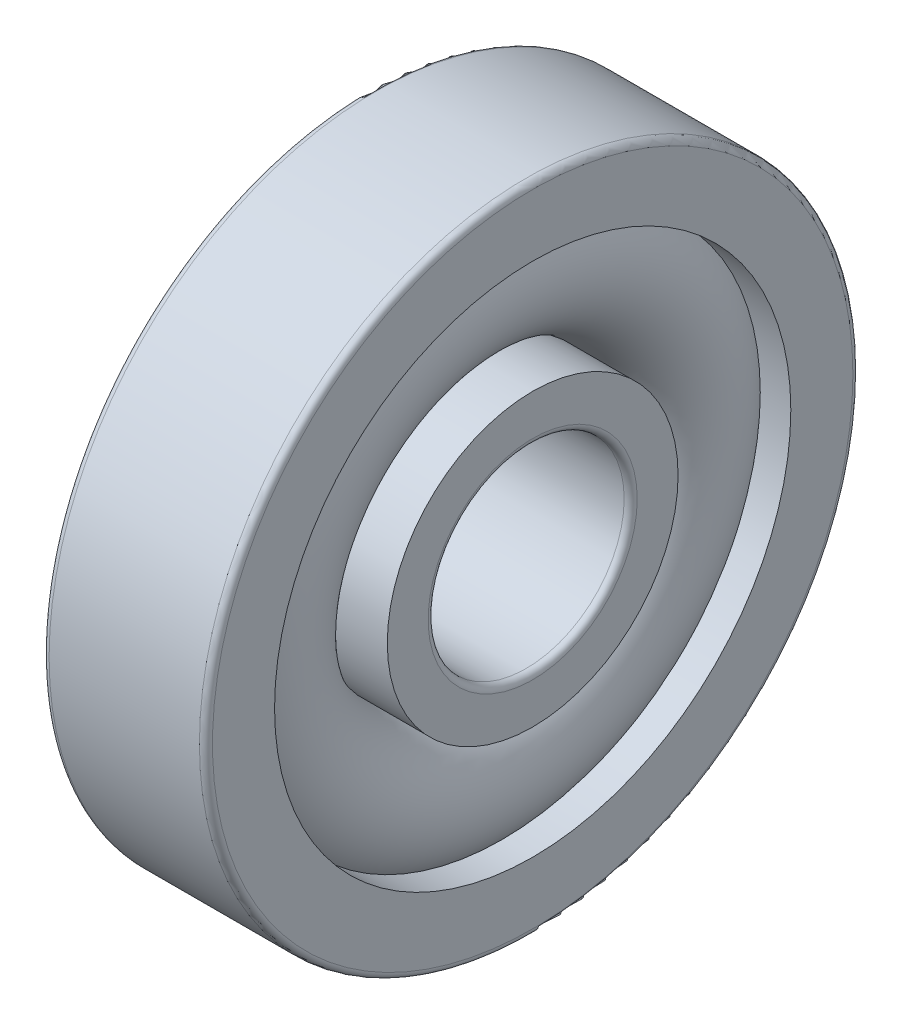
ISO-10303-21;
HEADER;
FILE_DESCRIPTION(('STEP AP214'),'2;1');
FILE_NAME('part.step','',(''),(''),'','','');
FILE_SCHEMA(('AUTOMOTIVE_DESIGN { 1 0 10303 214 1 1 1 1 }'));
ENDSEC;
DATA;
#1=APPLICATION_CONTEXT('core data for automotive mechanical design processes');
#2=APPLICATION_PROTOCOL_DEFINITION('international standard','automotive_design',2000,#1);
#3=PRODUCT_CONTEXT('',#1,'mechanical');
#4=PRODUCT('Part','Part','',(#3));
#5=PRODUCT_RELATED_PRODUCT_CATEGORY('part','',(#4));
#6=PRODUCT_DEFINITION_FORMATION('','',#4);
#7=PRODUCT_DEFINITION_CONTEXT('part definition',#1,'design');
#8=PRODUCT_DEFINITION('design','',#6,#7);
#9=PRODUCT_DEFINITION_SHAPE('','',#8);
#10=(LENGTH_UNIT() NAMED_UNIT(*) SI_UNIT(.MILLI.,.METRE.));
#11=(NAMED_UNIT(*) PLANE_ANGLE_UNIT() SI_UNIT($,.RADIAN.));
#12=(NAMED_UNIT(*) SI_UNIT($,.STERADIAN.) SOLID_ANGLE_UNIT());
#13=UNCERTAINTY_MEASURE_WITH_UNIT(LENGTH_MEASURE(1.E-05),#10,'distance_accuracy_value','');
#14=(GEOMETRIC_REPRESENTATION_CONTEXT(3) GLOBAL_UNCERTAINTY_ASSIGNED_CONTEXT((#13)) GLOBAL_UNIT_ASSIGNED_CONTEXT((#10,
#11,#12)) REPRESENTATION_CONTEXT('',''));
#15=CARTESIAN_POINT('',(0.,0.,0.));
#16=DIRECTION('',(0.,0.,1.));
#17=DIRECTION('',(1.,0.,0.));
#18=AXIS2_PLACEMENT_3D('',#15,#16,#17);
#19=CARTESIAN_POINT('',(0.,0.,0.));
#20=DIRECTION('',(-1.,0.,0.));
#21=DIRECTION('',(0.,0.,1.));
#22=AXIS2_PLACEMENT_3D('',#19,#20,#21);
#23=TOROIDAL_SURFACE('',#22,3.25,1.05);
#24=CARTESIAN_POINT('',(0.782623792124926,0.,0.));
#25=DIRECTION('',(-1.,0.,0.));
#26=DIRECTION('',(0.,0.,1.));
#27=AXIS2_PLACEMENT_3D('',#24,#25,#26);
#28=CIRCLE('',#27,3.95);
#29=CARTESIAN_POINT('',(0.782623792124926,0.,3.95));
#30=VERTEX_POINT('',#29);
#31=EDGE_CURVE('E39',#30,#30,#28,.F.);
#32=ORIENTED_EDGE('',*,*,#31,.T.);
#33=EDGE_LOOP('',(#32));
#34=FACE_BOUND('',#33,.T.);
#35=CARTESIAN_POINT('',(0.227760839478607,0.,0.));
#36=DIRECTION('',(-1.,0.,0.));
#37=DIRECTION('',(0.,0.,1.));
#38=AXIS2_PLACEMENT_3D('',#35,#36,#37);
#39=CIRCLE('',#38,2.225);
#40=CARTESIAN_POINT('',(0.227760839478607,0.,2.225));
#41=VERTEX_POINT('',#40);
#42=EDGE_CURVE('E10',#41,#41,#39,.T.);
#43=ORIENTED_EDGE('',*,*,#42,.T.);
#44=EDGE_LOOP('',(#43));
#45=FACE_BOUND('',#44,.T.);
#46=ADVANCED_FACE('F35',(#34,#45),#23,.T.);
#47=CARTESIAN_POINT('',(-20.6375,0.,0.));
#48=DIRECTION('',(1.,0.,0.));
#49=DIRECTION('',(0.,0.,-1.));
#50=AXIS2_PLACEMENT_3D('',#47,#48,#49);
#51=CYLINDRICAL_SURFACE('',#50,2.225);
#52=CARTESIAN_POINT('',(1.25,0.,0.));
#53=DIRECTION('',(1.,0.,0.));
#54=DIRECTION('',(0.,0.,-1.));
#55=AXIS2_PLACEMENT_3D('',#52,#53,#54);
#56=CIRCLE('',#55,2.225);
#57=CARTESIAN_POINT('',(1.25,0.,-2.225));
#58=VERTEX_POINT('',#57);
#59=EDGE_CURVE('E48',#58,#58,#56,.T.);
#60=ORIENTED_EDGE('',*,*,#59,.F.);
#61=EDGE_LOOP('',(#60));
#62=FACE_BOUND('',#61,.T.);
#63=ORIENTED_EDGE('',*,*,#42,.F.);
#64=EDGE_LOOP('',(#63));
#65=FACE_BOUND('',#64,.T.);
#66=ADVANCED_FACE('F87',(#62,#65),#51,.T.);
#67=CARTESIAN_POINT('',(-20.6375,0.,0.));
#68=DIRECTION('',(1.,0.,0.));
#69=DIRECTION('',(0.,0.,-1.));
#70=AXIS2_PLACEMENT_3D('',#67,#68,#69);
#71=CYLINDRICAL_SURFACE('',#70,2.55);
#72=CARTESIAN_POINT('',(-1.25,0.,0.));
#73=DIRECTION('',(1.,0.,0.));
#74=DIRECTION('',(0.,0.,-1.));
#75=AXIS2_PLACEMENT_3D('',#72,#73,#74);
#76=CIRCLE('',#75,2.55);
#77=CARTESIAN_POINT('',(-1.25,0.,-2.55));
#78=VERTEX_POINT('',#77);
#79=EDGE_CURVE('E57',#78,#78,#76,.T.);
#80=ORIENTED_EDGE('',*,*,#79,.T.);
#81=EDGE_LOOP('',(#80));
#82=FACE_BOUND('',#81,.T.);
#83=CARTESIAN_POINT('',(-0.782623792124926,0.,0.));
#84=DIRECTION('',(1.,0.,0.));
#85=DIRECTION('',(0.,0.,-1.));
#86=AXIS2_PLACEMENT_3D('',#83,#84,#85);
#87=CIRCLE('',#86,2.55);
#88=CARTESIAN_POINT('',(-0.782623792124926,0.,-2.55));
#89=VERTEX_POINT('',#88);
#90=EDGE_CURVE('E43',#89,#89,#87,.T.);
#91=ORIENTED_EDGE('',*,*,#90,.F.);
#92=EDGE_LOOP('',(#91));
#93=FACE_BOUND('',#92,.T.);
#94=ADVANCED_FACE('F90',(#82,#93),#71,.T.);
#95=CARTESIAN_POINT('',(1.25,1.6,0.));
#96=DIRECTION('',(1.,0.,0.));
#97=DIRECTION('',(0.,0.,-1.));
#98=AXIS2_PLACEMENT_3D('',#95,#96,#97);
#99=PLANE('',#98);
#100=ORIENTED_EDGE('',*,*,#59,.T.);
#101=EDGE_LOOP('',(#100));
#102=FACE_BOUND('',#101,.T.);
#103=CARTESIAN_POINT('',(1.25,0.,0.));
#104=DIRECTION('',(1.,0.,0.));
#105=DIRECTION('',(0.,0.,-1.));
#106=AXIS2_PLACEMENT_3D('',#103,#104,#105);
#107=CIRCLE('',#106,1.6);
#108=CARTESIAN_POINT('',(1.25,0.,-1.6));
#109=VERTEX_POINT('',#108);
#110=EDGE_CURVE('E79',#109,#109,#107,.T.);
#111=ORIENTED_EDGE('',*,*,#110,.F.);
#112=EDGE_LOOP('',(#111));
#113=FACE_BOUND('',#112,.T.);
#114=ADVANCED_FACE('F84',(#102,#113),#99,.T.);
#115=CARTESIAN_POINT('',(1.15,0.,0.));
#116=DIRECTION('',(1.,0.,0.));
#117=DIRECTION('',(0.,0.,-1.));
#118=AXIS2_PLACEMENT_3D('',#115,#116,#117);
#119=TOROIDAL_SURFACE('',#118,1.6,0.1);
#120=ORIENTED_EDGE('',*,*,#110,.T.);
#121=EDGE_LOOP('',(#120));
#122=FACE_BOUND('',#121,.T.);
#123=CARTESIAN_POINT('',(1.15,0.,0.));
#124=DIRECTION('',(1.,0.,0.));
#125=DIRECTION('',(0.,0.,-1.));
#126=AXIS2_PLACEMENT_3D('',#123,#124,#125);
#127=CIRCLE('',#126,1.5);
#128=CARTESIAN_POINT('',(1.15,0.,-1.5));
#129=VERTEX_POINT('',#128);
#130=EDGE_CURVE('E76',#129,#129,#127,.T.);
#131=ORIENTED_EDGE('',*,*,#130,.F.);
#132=EDGE_LOOP('',(#131));
#133=FACE_BOUND('',#132,.T.);
#134=ADVANCED_FACE('F101',(#122,#133),#119,.T.);
#135=CARTESIAN_POINT('',(-20.6375,0.,0.));
#136=DIRECTION('',(1.,0.,0.));
#137=DIRECTION('',(0.,0.,-1.));
#138=AXIS2_PLACEMENT_3D('',#135,#136,#137);
#139=CYLINDRICAL_SURFACE('',#138,1.5);
#140=ORIENTED_EDGE('',*,*,#130,.T.);
#141=EDGE_LOOP('',(#140));
#142=FACE_BOUND('',#141,.T.);
#143=CARTESIAN_POINT('',(-1.15,0.,0.));
#144=DIRECTION('',(1.,0.,0.));
#145=DIRECTION('',(0.,0.,-1.));
#146=AXIS2_PLACEMENT_3D('',#143,#144,#145);
#147=CIRCLE('',#146,1.5);
#148=CARTESIAN_POINT('',(-1.15,0.,-1.5));
#149=VERTEX_POINT('',#148);
#150=EDGE_CURVE('E73',#149,#149,#147,.T.);
#151=ORIENTED_EDGE('',*,*,#150,.F.);
#152=EDGE_LOOP('',(#151));
#153=FACE_BOUND('',#152,.T.);
#154=ADVANCED_FACE('F104',(#142,#153),#139,.F.);
#155=CARTESIAN_POINT('',(-1.15,0.,0.));
#156=DIRECTION('',(1.,0.,0.));
#157=DIRECTION('',(0.,0.,-1.));
#158=AXIS2_PLACEMENT_3D('',#155,#156,#157);
#159=TOROIDAL_SURFACE('',#158,1.6,0.1);
#160=ORIENTED_EDGE('',*,*,#150,.T.);
#161=EDGE_LOOP('',(#160));
#162=FACE_BOUND('',#161,.T.);
#163=CARTESIAN_POINT('',(-1.25,0.,0.));
#164=DIRECTION('',(1.,0.,0.));
#165=DIRECTION('',(0.,0.,-1.));
#166=AXIS2_PLACEMENT_3D('',#163,#164,#165);
#167=CIRCLE('',#166,1.6);
#168=CARTESIAN_POINT('',(-1.25,0.,-1.6));
#169=VERTEX_POINT('',#168);
#170=EDGE_CURVE('E70',#169,#169,#167,.T.);
#171=ORIENTED_EDGE('',*,*,#170,.F.);
#172=EDGE_LOOP('',(#171));
#173=FACE_BOUND('',#172,.T.);
#174=ADVANCED_FACE('F108',(#162,#173),#159,.T.);
#175=CARTESIAN_POINT('',(-1.25,2.55,0.));
#176=DIRECTION('',(-1.,0.,0.));
#177=DIRECTION('',(0.,0.,1.));
#178=AXIS2_PLACEMENT_3D('',#175,#176,#177);
#179=PLANE('',#178);
#180=ORIENTED_EDGE('',*,*,#170,.T.);
#181=EDGE_LOOP('',(#180));
#182=FACE_BOUND('',#181,.T.);
#183=ORIENTED_EDGE('',*,*,#79,.F.);
#184=EDGE_LOOP('',(#183));
#185=FACE_BOUND('',#184,.T.);
#186=ADVANCED_FACE('F112',(#182,#185),#179,.T.);
#187=CARTESIAN_POINT('',(-0.227760839478607,0.,0.));
#188=DIRECTION('',(1.,0.,0.));
#189=DIRECTION('',(0.,0.,-1.));
#190=AXIS2_PLACEMENT_3D('',#187,#188,#189);
#191=CIRCLE('',#190,4.275);
#192=CARTESIAN_POINT('',(-0.227760839478607,0.,-4.275));
#193=VERTEX_POINT('',#192);
#194=EDGE_CURVE('E51',#193,#193,#191,.F.);
#195=ORIENTED_EDGE('',*,*,#194,.T.);
#196=EDGE_LOOP('',(#195));
#197=FACE_BOUND('',#196,.T.);
#198=ORIENTED_EDGE('',*,*,#90,.T.);
#199=EDGE_LOOP('',(#198));
#200=FACE_BOUND('',#199,.T.);
#201=ADVANCED_FACE('F37',(#197,#200),#23,.T.);
#202=CARTESIAN_POINT('',(-20.6375,0.,0.));
#203=DIRECTION('',(1.,0.,0.));
#204=DIRECTION('',(0.,0.,-1.));
#205=AXIS2_PLACEMENT_3D('',#202,#203,#204);
#206=CYLINDRICAL_SURFACE('',#205,3.95);
#207=CARTESIAN_POINT('',(1.25,0.,0.));
#208=DIRECTION('',(1.,0.,0.));
#209=DIRECTION('',(0.,0.,-1.));
#210=AXIS2_PLACEMENT_3D('',#207,#208,#209);
#211=CIRCLE('',#210,3.95);
#212=CARTESIAN_POINT('',(1.25,0.,-3.95));
#213=VERTEX_POINT('',#212);
#214=EDGE_CURVE('E153',#213,#213,#211,.T.);
#215=ORIENTED_EDGE('',*,*,#214,.T.);
#216=EDGE_LOOP('',(#215));
#217=FACE_BOUND('',#216,.T.);
#218=ORIENTED_EDGE('',*,*,#31,.F.);
#219=EDGE_LOOP('',(#218));
#220=FACE_BOUND('',#219,.T.);
#221=ADVANCED_FACE('F134',(#217,#220),#206,.F.);
#222=CARTESIAN_POINT('',(-20.6375,0.,0.));
#223=DIRECTION('',(1.,0.,0.));
#224=DIRECTION('',(0.,0.,-1.));
#225=AXIS2_PLACEMENT_3D('',#222,#223,#224);
#226=CYLINDRICAL_SURFACE('',#225,4.275);
#227=CARTESIAN_POINT('',(-1.25,0.,0.));
#228=DIRECTION('',(1.,0.,0.));
#229=DIRECTION('',(0.,0.,-1.));
#230=AXIS2_PLACEMENT_3D('',#227,#228,#229);
#231=CIRCLE('',#230,4.275);
#232=CARTESIAN_POINT('',(-1.25,0.,-4.275));
#233=VERTEX_POINT('',#232);
#234=EDGE_CURVE('E148',#233,#233,#231,.T.);
#235=ORIENTED_EDGE('',*,*,#234,.F.);
#236=EDGE_LOOP('',(#235));
#237=FACE_BOUND('',#236,.T.);
#238=ORIENTED_EDGE('',*,*,#194,.F.);
#239=EDGE_LOOP('',(#238));
#240=FACE_BOUND('',#239,.T.);
#241=ADVANCED_FACE('F121',(#237,#240),#226,.F.);
#242=CARTESIAN_POINT('',(-1.15,0.,0.));
#243=DIRECTION('',(1.,0.,0.));
#244=DIRECTION('',(0.,0.,-1.));
#245=AXIS2_PLACEMENT_3D('',#242,#243,#244);
#246=TOROIDAL_SURFACE('',#245,4.9,0.0999999999999986);
#247=CARTESIAN_POINT('',(-1.25,0.,0.));
#248=DIRECTION('',(1.,0.,0.));
#249=DIRECTION('',(0.,0.,-1.));
#250=AXIS2_PLACEMENT_3D('',#247,#248,#249);
#251=CIRCLE('',#250,4.9);
#252=CARTESIAN_POINT('',(-1.25,0.,-4.9));
#253=VERTEX_POINT('',#252);
#254=EDGE_CURVE('E151',#253,#253,#251,.T.);
#255=ORIENTED_EDGE('',*,*,#254,.T.);
#256=EDGE_LOOP('',(#255));
#257=FACE_BOUND('',#256,.T.);
#258=CARTESIAN_POINT('',(-1.15,0.,0.));
#259=DIRECTION('',(1.,0.,0.));
#260=DIRECTION('',(0.,0.,-1.));
#261=AXIS2_PLACEMENT_3D('',#258,#259,#260);
#262=CIRCLE('',#261,5.);
#263=CARTESIAN_POINT('',(-1.15,0.,-5.));
#264=VERTEX_POINT('',#263);
#265=EDGE_CURVE('E53',#264,#264,#262,.T.);
#266=ORIENTED_EDGE('',*,*,#265,.F.);
#267=EDGE_LOOP('',(#266));
#268=FACE_BOUND('',#267,.T.);
#269=ADVANCED_FACE('F117',(#257,#268),#246,.T.);
#270=CARTESIAN_POINT('',(-20.6375,0.,0.));
#271=DIRECTION('',(1.,0.,0.));
#272=DIRECTION('',(0.,0.,-1.));
#273=AXIS2_PLACEMENT_3D('',#270,#271,#272);
#274=CYLINDRICAL_SURFACE('',#273,5.);
#275=ORIENTED_EDGE('',*,*,#265,.T.);
#276=EDGE_LOOP('',(#275));
#277=FACE_BOUND('',#276,.T.);
#278=CARTESIAN_POINT('',(1.15,0.,0.));
#279=DIRECTION('',(1.,0.,0.));
#280=DIRECTION('',(0.,0.,-1.));
#281=AXIS2_PLACEMENT_3D('',#278,#279,#280);
#282=CIRCLE('',#281,5.);
#283=CARTESIAN_POINT('',(1.15,0.,-5.));
#284=VERTEX_POINT('',#283);
#285=EDGE_CURVE('E59',#284,#284,#282,.T.);
#286=ORIENTED_EDGE('',*,*,#285,.F.);
#287=EDGE_LOOP('',(#286));
#288=FACE_BOUND('',#287,.T.);
#289=ADVANCED_FACE('F120',(#277,#288),#274,.T.);
#290=CARTESIAN_POINT('',(1.15,0.,0.));
#291=DIRECTION('',(1.,0.,0.));
#292=DIRECTION('',(0.,0.,-1.));
#293=AXIS2_PLACEMENT_3D('',#290,#291,#292);
#294=TOROIDAL_SURFACE('',#293,4.9,0.0999999999999986);
#295=ORIENTED_EDGE('',*,*,#285,.T.);
#296=EDGE_LOOP('',(#295));
#297=FACE_BOUND('',#296,.T.);
#298=CARTESIAN_POINT('',(1.25,0.,0.));
#299=DIRECTION('',(1.,0.,0.));
#300=DIRECTION('',(0.,0.,-1.));
#301=AXIS2_PLACEMENT_3D('',#298,#299,#300);
#302=CIRCLE('',#301,4.9);
#303=CARTESIAN_POINT('',(1.25,0.,-4.9));
#304=VERTEX_POINT('',#303);
#305=EDGE_CURVE('E64',#304,#304,#302,.T.);
#306=ORIENTED_EDGE('',*,*,#305,.F.);
#307=EDGE_LOOP('',(#306));
#308=FACE_BOUND('',#307,.T.);
#309=ADVANCED_FACE('F125',(#297,#308),#294,.T.);
#310=CARTESIAN_POINT('',(1.25,4.9,0.));
#311=DIRECTION('',(1.,0.,0.));
#312=DIRECTION('',(0.,0.,-1.));
#313=AXIS2_PLACEMENT_3D('',#310,#311,#312);
#314=PLANE('',#313);
#315=ORIENTED_EDGE('',*,*,#305,.T.);
#316=EDGE_LOOP('',(#315));
#317=FACE_BOUND('',#316,.T.);
#318=ORIENTED_EDGE('',*,*,#214,.F.);
#319=EDGE_LOOP('',(#318));
#320=FACE_BOUND('',#319,.T.);
#321=ADVANCED_FACE('F128',(#317,#320),#314,.T.);
#322=CARTESIAN_POINT('',(-1.25,4.275,0.));
#323=DIRECTION('',(-1.,0.,0.));
#324=DIRECTION('',(0.,0.,1.));
#325=AXIS2_PLACEMENT_3D('',#322,#323,#324);
#326=PLANE('',#325);
#327=ORIENTED_EDGE('',*,*,#234,.T.);
#328=EDGE_LOOP('',(#327));
#329=FACE_BOUND('',#328,.T.);
#330=ORIENTED_EDGE('',*,*,#254,.F.);
#331=EDGE_LOOP('',(#330));
#332=FACE_BOUND('',#331,.T.);
#333=ADVANCED_FACE('F132',(#329,#332),#326,.T.);
#334=CLOSED_SHELL('',(#46,#66,#94,#114,#134,#154,#174,#186,#201,#221,#241,#269,#289,#309,#321,#333));
#335=MANIFOLD_SOLID_BREP('B2',#334);
#336=ADVANCED_BREP_SHAPE_REPRESENTATION('',(#18,#335),#14);
#337=SHAPE_DEFINITION_REPRESENTATION(#9,#336);
ENDSEC;
END-ISO-10303-21;
